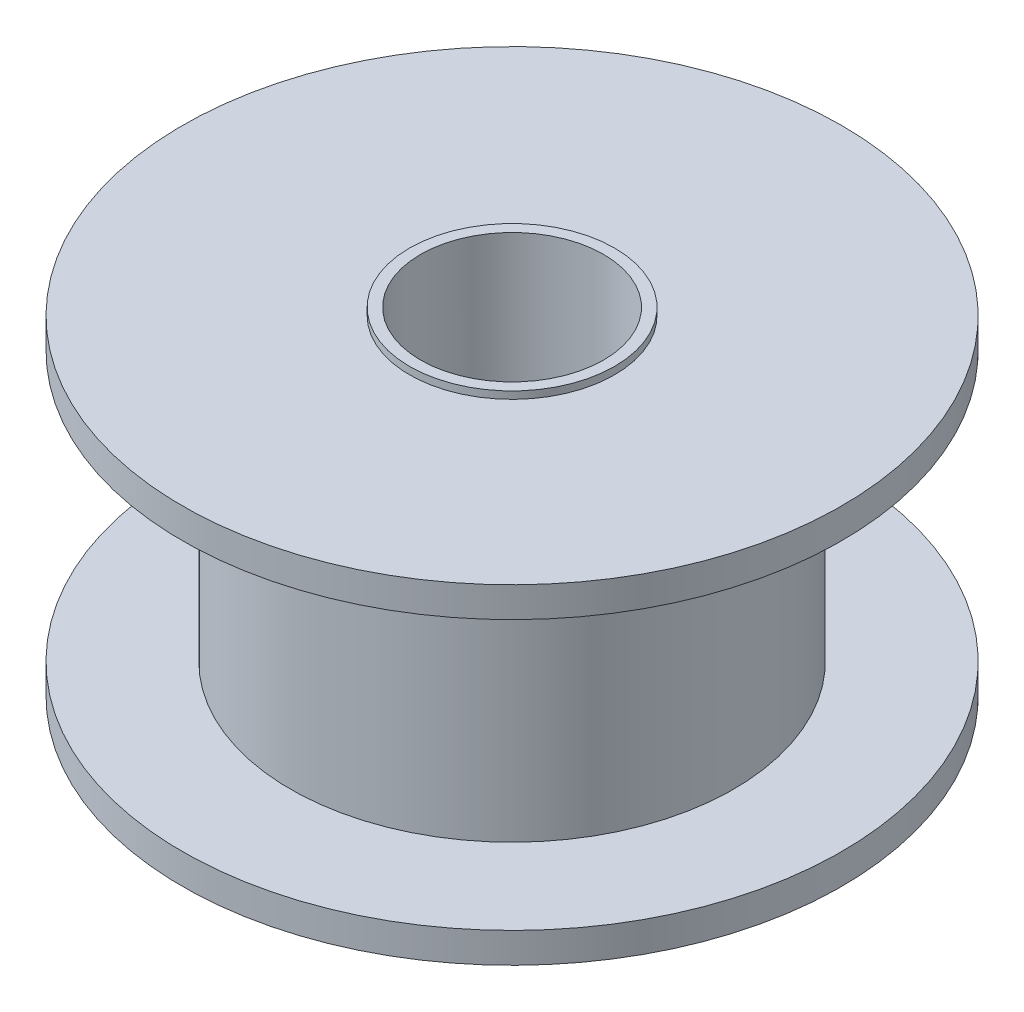
ISO-10303-21;
HEADER;
FILE_DESCRIPTION(('STEP AP214'),'2;1');
FILE_NAME('part.step','',(''),(''),'','','');
FILE_SCHEMA(('AUTOMOTIVE_DESIGN { 1 0 10303 214 1 1 1 1 }'));
ENDSEC;
DATA;
#1=APPLICATION_CONTEXT('core data for automotive mechanical design processes');
#2=APPLICATION_PROTOCOL_DEFINITION('international standard','automotive_design',2000,#1);
#3=PRODUCT_CONTEXT('',#1,'mechanical');
#4=PRODUCT('Part','Part','',(#3));
#5=PRODUCT_RELATED_PRODUCT_CATEGORY('part','',(#4));
#6=PRODUCT_DEFINITION_FORMATION('','',#4);
#7=PRODUCT_DEFINITION_CONTEXT('part definition',#1,'design');
#8=PRODUCT_DEFINITION('design','',#6,#7);
#9=PRODUCT_DEFINITION_SHAPE('','',#8);
#10=(LENGTH_UNIT() NAMED_UNIT(*) SI_UNIT(.MILLI.,.METRE.));
#11=(NAMED_UNIT(*) PLANE_ANGLE_UNIT() SI_UNIT($,.RADIAN.));
#12=(NAMED_UNIT(*) SI_UNIT($,.STERADIAN.) SOLID_ANGLE_UNIT());
#13=UNCERTAINTY_MEASURE_WITH_UNIT(LENGTH_MEASURE(1.E-05),#10,'distance_accuracy_value','');
#14=(GEOMETRIC_REPRESENTATION_CONTEXT(3) GLOBAL_UNCERTAINTY_ASSIGNED_CONTEXT((#13)) GLOBAL_UNIT_ASSIGNED_CONTEXT((#10,
#11,#12)) REPRESENTATION_CONTEXT('',''));
#15=CARTESIAN_POINT('',(0.,0.,0.));
#16=DIRECTION('',(0.,0.,1.));
#17=DIRECTION('',(1.,0.,0.));
#18=AXIS2_PLACEMENT_3D('',#15,#16,#17);
#19=CARTESIAN_POINT('',(-2.5,-4.5,0.));
#20=DIRECTION('',(0.,1.,0.));
#21=DIRECTION('',(0.,0.,1.));
#22=AXIS2_PLACEMENT_3D('',#19,#20,#21);
#23=PLANE('',#22);
#24=CARTESIAN_POINT('',(0.,-4.5,0.));
#25=DIRECTION('',(0.,-1.,0.));
#26=DIRECTION('',(0.,0.,-1.));
#27=AXIS2_PLACEMENT_3D('',#24,#25,#26);
#28=CIRCLE('',#27,9.);
#29=CARTESIAN_POINT('',(0.,-4.5,-9.));
#30=VERTEX_POINT('',#29);
#31=EDGE_CURVE('E42',#30,#30,#28,.T.);
#32=ORIENTED_EDGE('',*,*,#31,.T.);
#33=EDGE_LOOP('',(#32));
#34=FACE_BOUND('',#33,.T.);
#35=CARTESIAN_POINT('',(0.,-4.5,0.));
#36=DIRECTION('',(0.,1.,0.));
#37=DIRECTION('',(0.,0.,1.));
#38=AXIS2_PLACEMENT_3D('',#35,#36,#37);
#39=CIRCLE('',#38,2.8);
#40=CARTESIAN_POINT('',(0.,-4.5,2.8));
#41=VERTEX_POINT('',#40);
#42=EDGE_CURVE('E10',#41,#41,#39,.F.);
#43=ORIENTED_EDGE('',*,*,#42,.F.);
#44=EDGE_LOOP('',(#43));
#45=FACE_BOUND('',#44,.T.);
#46=ADVANCED_FACE('F32',(#34,#45),#23,.F.);
#47=CARTESIAN_POINT('',(-9.,4.5,0.));
#48=DIRECTION('',(0.,-1.,0.));
#49=DIRECTION('',(0.,0.,-1.));
#50=AXIS2_PLACEMENT_3D('',#47,#48,#49);
#51=PLANE('',#50);
#52=CARTESIAN_POINT('',(0.,4.5,0.));
#53=DIRECTION('',(0.,-1.,0.));
#54=DIRECTION('',(0.,0.,-1.));
#55=AXIS2_PLACEMENT_3D('',#52,#53,#54);
#56=CIRCLE('',#55,9.);
#57=CARTESIAN_POINT('',(0.,4.5,-9.));
#58=VERTEX_POINT('',#57);
#59=EDGE_CURVE('E60',#58,#58,#56,.T.);
#60=ORIENTED_EDGE('',*,*,#59,.F.);
#61=EDGE_LOOP('',(#60));
#62=FACE_BOUND('',#61,.T.);
#63=CARTESIAN_POINT('',(0.,4.5,0.));
#64=DIRECTION('',(0.,-1.,0.));
#65=DIRECTION('',(0.,0.,-1.));
#66=AXIS2_PLACEMENT_3D('',#63,#64,#65);
#67=CIRCLE('',#66,2.8);
#68=CARTESIAN_POINT('',(0.,4.5,-2.8));
#69=VERTEX_POINT('',#68);
#70=EDGE_CURVE('E38',#69,#69,#67,.F.);
#71=ORIENTED_EDGE('',*,*,#70,.F.);
#72=EDGE_LOOP('',(#71));
#73=FACE_BOUND('',#72,.T.);
#74=ADVANCED_FACE('F94',(#62,#73),#51,.F.);
#75=CARTESIAN_POINT('',(0.,0.,0.));
#76=DIRECTION('',(0.,-1.,0.));
#77=DIRECTION('',(0.,0.,-1.));
#78=AXIS2_PLACEMENT_3D('',#75,#76,#77);
#79=CYLINDRICAL_SURFACE('',#78,9.);
#80=ORIENTED_EDGE('',*,*,#31,.F.);
#81=EDGE_LOOP('',(#80));
#82=FACE_BOUND('',#81,.T.);
#83=CARTESIAN_POINT('',(0.,-3.675,0.));
#84=DIRECTION('',(0.,-1.,0.));
#85=DIRECTION('',(0.,0.,-1.));
#86=AXIS2_PLACEMENT_3D('',#83,#84,#85);
#87=CIRCLE('',#86,9.);
#88=CARTESIAN_POINT('',(0.,-3.675,-9.));
#89=VERTEX_POINT('',#88);
#90=EDGE_CURVE('E46',#89,#89,#87,.T.);
#91=ORIENTED_EDGE('',*,*,#90,.T.);
#92=EDGE_LOOP('',(#91));
#93=FACE_BOUND('',#92,.T.);
#94=ADVANCED_FACE('F99',(#82,#93),#79,.T.);
#95=CARTESIAN_POINT('',(-9.,-3.675,0.));
#96=DIRECTION('',(0.,-1.,0.));
#97=DIRECTION('',(0.,0.,-1.));
#98=AXIS2_PLACEMENT_3D('',#95,#96,#97);
#99=PLANE('',#98);
#100=ORIENTED_EDGE('',*,*,#90,.F.);
#101=EDGE_LOOP('',(#100));
#102=FACE_BOUND('',#101,.T.);
#103=CARTESIAN_POINT('',(0.,-3.675,0.));
#104=DIRECTION('',(0.,-1.,0.));
#105=DIRECTION('',(0.,0.,-1.));
#106=AXIS2_PLACEMENT_3D('',#103,#104,#105);
#107=CIRCLE('',#106,6.05);
#108=CARTESIAN_POINT('',(0.,-3.675,-6.05));
#109=VERTEX_POINT('',#108);
#110=EDGE_CURVE('E51',#109,#109,#107,.T.);
#111=ORIENTED_EDGE('',*,*,#110,.T.);
#112=EDGE_LOOP('',(#111));
#113=FACE_BOUND('',#112,.T.);
#114=ADVANCED_FACE('F107',(#102,#113),#99,.F.);
#115=CARTESIAN_POINT('',(0.,0.,0.));
#116=DIRECTION('',(0.,-1.,0.));
#117=DIRECTION('',(0.,0.,-1.));
#118=AXIS2_PLACEMENT_3D('',#115,#116,#117);
#119=CYLINDRICAL_SURFACE('',#118,6.05);
#120=ORIENTED_EDGE('',*,*,#110,.F.);
#121=EDGE_LOOP('',(#120));
#122=FACE_BOUND('',#121,.T.);
#123=CARTESIAN_POINT('',(0.,3.675,0.));
#124=DIRECTION('',(0.,-1.,0.));
#125=DIRECTION('',(0.,0.,-1.));
#126=AXIS2_PLACEMENT_3D('',#123,#124,#125);
#127=CIRCLE('',#126,6.05);
#128=CARTESIAN_POINT('',(0.,3.675,-6.05));
#129=VERTEX_POINT('',#128);
#130=EDGE_CURVE('E54',#129,#129,#127,.T.);
#131=ORIENTED_EDGE('',*,*,#130,.T.);
#132=EDGE_LOOP('',(#131));
#133=FACE_BOUND('',#132,.T.);
#134=ADVANCED_FACE('F112',(#122,#133),#119,.T.);
#135=CARTESIAN_POINT('',(-6.05,3.675,0.));
#136=DIRECTION('',(0.,1.,0.));
#137=DIRECTION('',(0.,0.,1.));
#138=AXIS2_PLACEMENT_3D('',#135,#136,#137);
#139=PLANE('',#138);
#140=ORIENTED_EDGE('',*,*,#130,.F.);
#141=EDGE_LOOP('',(#140));
#142=FACE_BOUND('',#141,.T.);
#143=CARTESIAN_POINT('',(0.,3.675,0.));
#144=DIRECTION('',(0.,-1.,0.));
#145=DIRECTION('',(0.,0.,-1.));
#146=AXIS2_PLACEMENT_3D('',#143,#144,#145);
#147=CIRCLE('',#146,9.);
#148=CARTESIAN_POINT('',(0.,3.675,-9.));
#149=VERTEX_POINT('',#148);
#150=EDGE_CURVE('E57',#149,#149,#147,.T.);
#151=ORIENTED_EDGE('',*,*,#150,.T.);
#152=EDGE_LOOP('',(#151));
#153=FACE_BOUND('',#152,.T.);
#154=ADVANCED_FACE('F118',(#142,#153),#139,.F.);
#155=CARTESIAN_POINT('',(0.,0.,0.));
#156=DIRECTION('',(0.,-1.,0.));
#157=DIRECTION('',(0.,0.,-1.));
#158=AXIS2_PLACEMENT_3D('',#155,#156,#157);
#159=CYLINDRICAL_SURFACE('',#158,9.);
#160=ORIENTED_EDGE('',*,*,#150,.F.);
#161=EDGE_LOOP('',(#160));
#162=FACE_BOUND('',#161,.T.);
#163=ORIENTED_EDGE('',*,*,#59,.T.);
#164=EDGE_LOOP('',(#163));
#165=FACE_BOUND('',#164,.T.);
#166=ADVANCED_FACE('F124',(#162,#165),#159,.T.);
#167=CARTESIAN_POINT('',(0.,0.,0.));
#168=DIRECTION('',(0.,-1.,0.));
#169=DIRECTION('',(0.,0.,-1.));
#170=AXIS2_PLACEMENT_3D('',#167,#168,#169);
#171=CYLINDRICAL_SURFACE('',#170,2.5);
#172=CARTESIAN_POINT('',(0.,4.7,0.));
#173=DIRECTION('',(0.,1.,0.));
#174=DIRECTION('',(0.,0.,1.));
#175=AXIS2_PLACEMENT_3D('',#172,#173,#174);
#176=CIRCLE('',#175,2.5);
#177=CARTESIAN_POINT('',(0.,4.7,2.5));
#178=VERTEX_POINT('',#177);
#179=EDGE_CURVE('E66',#178,#178,#176,.T.);
#180=ORIENTED_EDGE('',*,*,#179,.T.);
#181=EDGE_LOOP('',(#180));
#182=FACE_BOUND('',#181,.T.);
#183=CARTESIAN_POINT('',(0.,-4.7,0.));
#184=DIRECTION('',(0.,-1.,0.));
#185=DIRECTION('',(0.,0.,-1.));
#186=AXIS2_PLACEMENT_3D('',#183,#184,#185);
#187=CIRCLE('',#186,2.5);
#188=CARTESIAN_POINT('',(0.,-4.7,-2.5));
#189=VERTEX_POINT('',#188);
#190=EDGE_CURVE('E72',#189,#189,#187,.T.);
#191=ORIENTED_EDGE('',*,*,#190,.T.);
#192=EDGE_LOOP('',(#191));
#193=FACE_BOUND('',#192,.T.);
#194=ADVANCED_FACE('F76',(#182,#193),#171,.F.);
#195=CARTESIAN_POINT('',(0.,4.7,0.));
#196=DIRECTION('',(0.,1.,0.));
#197=DIRECTION('',(0.,0.,1.));
#198=AXIS2_PLACEMENT_3D('',#195,#196,#197);
#199=PLANE('',#198);
#200=CARTESIAN_POINT('',(0.,4.7,0.));
#201=DIRECTION('',(0.,1.,0.));
#202=DIRECTION('',(0.,0.,1.));
#203=AXIS2_PLACEMENT_3D('',#200,#201,#202);
#204=CIRCLE('',#203,2.8);
#205=CARTESIAN_POINT('',(0.,4.7,2.8));
#206=VERTEX_POINT('',#205);
#207=EDGE_CURVE('E63',#206,#206,#204,.T.);
#208=ORIENTED_EDGE('',*,*,#207,.T.);
#209=EDGE_LOOP('',(#208));
#210=FACE_BOUND('',#209,.T.);
#211=ORIENTED_EDGE('',*,*,#179,.F.);
#212=EDGE_LOOP('',(#211));
#213=FACE_BOUND('',#212,.T.);
#214=ADVANCED_FACE('F90',(#210,#213),#199,.T.);
#215=CARTESIAN_POINT('',(0.,4.7,0.));
#216=DIRECTION('',(0.,-1.,0.));
#217=DIRECTION('',(0.,0.,-1.));
#218=AXIS2_PLACEMENT_3D('',#215,#216,#217);
#219=CYLINDRICAL_SURFACE('',#218,2.8);
#220=ORIENTED_EDGE('',*,*,#207,.F.);
#221=EDGE_LOOP('',(#220));
#222=FACE_BOUND('',#221,.T.);
#223=ORIENTED_EDGE('',*,*,#70,.T.);
#224=EDGE_LOOP('',(#223));
#225=FACE_BOUND('',#224,.T.);
#226=ADVANCED_FACE('F81',(#222,#225),#219,.T.);
#227=CARTESIAN_POINT('',(0.,-4.7,0.));
#228=DIRECTION('',(0.,-1.,0.));
#229=DIRECTION('',(0.,0.,-1.));
#230=AXIS2_PLACEMENT_3D('',#227,#228,#229);
#231=PLANE('',#230);
#232=CARTESIAN_POINT('',(0.,-4.7,0.));
#233=DIRECTION('',(0.,-1.,0.));
#234=DIRECTION('',(0.,0.,-1.));
#235=AXIS2_PLACEMENT_3D('',#232,#233,#234);
#236=CIRCLE('',#235,2.8);
#237=CARTESIAN_POINT('',(0.,-4.7,-2.8));
#238=VERTEX_POINT('',#237);
#239=EDGE_CURVE('E69',#238,#238,#236,.T.);
#240=ORIENTED_EDGE('',*,*,#239,.T.);
#241=EDGE_LOOP('',(#240));
#242=FACE_BOUND('',#241,.T.);
#243=ORIENTED_EDGE('',*,*,#190,.F.);
#244=EDGE_LOOP('',(#243));
#245=FACE_BOUND('',#244,.T.);
#246=ADVANCED_FACE('F78',(#242,#245),#231,.T.);
#247=CARTESIAN_POINT('',(0.,-4.7,0.));
#248=DIRECTION('',(0.,1.,0.));
#249=DIRECTION('',(0.,0.,1.));
#250=AXIS2_PLACEMENT_3D('',#247,#248,#249);
#251=CYLINDRICAL_SURFACE('',#250,2.8);
#252=ORIENTED_EDGE('',*,*,#239,.F.);
#253=EDGE_LOOP('',(#252));
#254=FACE_BOUND('',#253,.T.);
#255=ORIENTED_EDGE('',*,*,#42,.T.);
#256=EDGE_LOOP('',(#255));
#257=FACE_BOUND('',#256,.T.);
#258=ADVANCED_FACE('F80',(#254,#257),#251,.T.);
#259=CLOSED_SHELL('',(#46,#74,#94,#114,#134,#154,#166,#194,#214,#226,#246,#258));
#260=MANIFOLD_SOLID_BREP('B2',#259);
#261=ADVANCED_BREP_SHAPE_REPRESENTATION('',(#18,#260),#14);
#262=SHAPE_DEFINITION_REPRESENTATION(#9,#261);
ENDSEC;
END-ISO-10303-21;
